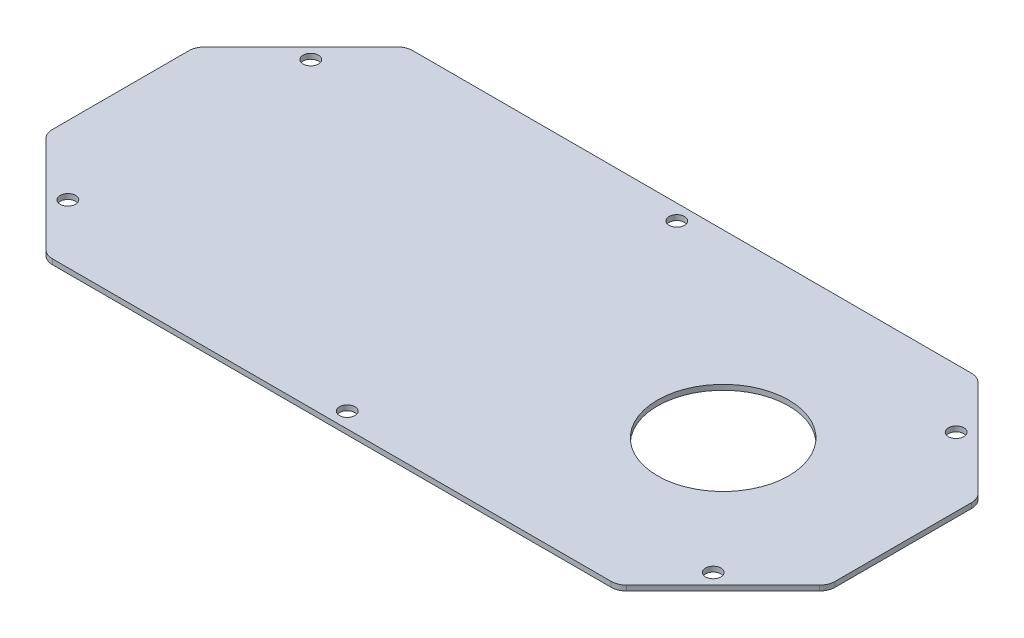
ISO-10303-21;
HEADER;
FILE_DESCRIPTION(('STEP AP214'),'2;1');
FILE_NAME('part.step','',(''),(''),'','','');
FILE_SCHEMA(('AUTOMOTIVE_DESIGN { 1 0 10303 214 1 1 1 1 }'));
ENDSEC;
DATA;
#1=APPLICATION_CONTEXT('core data for automotive mechanical design processes');
#2=APPLICATION_PROTOCOL_DEFINITION('international standard','automotive_design',2000,#1);
#3=PRODUCT_CONTEXT('',#1,'mechanical');
#4=PRODUCT('Part','Part','',(#3));
#5=PRODUCT_RELATED_PRODUCT_CATEGORY('part','',(#4));
#6=PRODUCT_DEFINITION_FORMATION('','',#4);
#7=PRODUCT_DEFINITION_CONTEXT('part definition',#1,'design');
#8=PRODUCT_DEFINITION('design','',#6,#7);
#9=PRODUCT_DEFINITION_SHAPE('','',#8);
#10=(LENGTH_UNIT() NAMED_UNIT(*) SI_UNIT(.MILLI.,.METRE.));
#11=(NAMED_UNIT(*) PLANE_ANGLE_UNIT() SI_UNIT($,.RADIAN.));
#12=(NAMED_UNIT(*) SI_UNIT($,.STERADIAN.) SOLID_ANGLE_UNIT());
#13=UNCERTAINTY_MEASURE_WITH_UNIT(LENGTH_MEASURE(1.E-05),#10,'distance_accuracy_value','');
#14=(GEOMETRIC_REPRESENTATION_CONTEXT(3) GLOBAL_UNCERTAINTY_ASSIGNED_CONTEXT((#13)) GLOBAL_UNIT_ASSIGNED_CONTEXT((#10,
#11,#12)) REPRESENTATION_CONTEXT('',''));
#15=CARTESIAN_POINT('',(0.,0.,0.));
#16=DIRECTION('',(0.,0.,1.));
#17=DIRECTION('',(1.,0.,0.));
#18=AXIS2_PLACEMENT_3D('',#15,#16,#17);
#19=CARTESIAN_POINT('',(-96.5025253169417,-1.,35.));
#20=DIRECTION('',(-0.707106781186547,0.,0.707106781186548));
#21=DIRECTION('',(0.707106781186548,0.,0.707106781186547));
#22=AXIS2_PLACEMENT_3D('',#19,#20,#21);
#23=PLANE('',#22);
#24=DIRECTION('',(0.707106781186548,0.,0.707106781186547));
#25=VECTOR('',#24,1.);
#26=CARTESIAN_POINT('',(-96.5025253169417,0.,35.));
#27=LINE('',#26,#25);
#28=CARTESIAN_POINT('',(-116.126845660501,0.,15.3756796564404));
#29=VERTEX_POINT('',#28);
#30=CARTESIAN_POINT('',(-97.3812049733821,0.,34.1213203435597));
#31=VERTEX_POINT('',#30);
#32=EDGE_CURVE('E258',#29,#31,#27,.T.);
#33=ORIENTED_EDGE('',*,*,#32,.F.);
#34=DIRECTION('',(0.,1.,0.));
#35=VECTOR('',#34,1.);
#36=CARTESIAN_POINT('',(-116.126845660501,-1.,15.3756796564404));
#37=LINE('',#36,#35);
#38=CARTESIAN_POINT('',(-116.126845660501,-1.,15.3756796564404));
#39=VERTEX_POINT('',#38);
#40=EDGE_CURVE('E236',#29,#39,#37,.F.);
#41=ORIENTED_EDGE('',*,*,#40,.T.);
#42=DIRECTION('',(0.707106781186548,0.,0.707106781186547));
#43=VECTOR('',#42,1.);
#44=CARTESIAN_POINT('',(-96.5025253169417,-1.,35.));
#45=LINE('',#44,#43);
#46=CARTESIAN_POINT('',(-97.3812049733821,-1.,34.1213203435597));
#47=VERTEX_POINT('',#46);
#48=EDGE_CURVE('E272',#39,#47,#45,.T.);
#49=ORIENTED_EDGE('',*,*,#48,.T.);
#50=DIRECTION('',(0.,1.,0.));
#51=VECTOR('',#50,1.);
#52=CARTESIAN_POINT('',(-97.3812049733821,-1.,34.1213203435597));
#53=LINE('',#52,#51);
#54=EDGE_CURVE('E233',#47,#31,#53,.T.);
#55=ORIENTED_EDGE('',*,*,#54,.T.);
#56=EDGE_LOOP('',(#33,#41,#49,#55));
#57=FACE_BOUND('',#56,.T.);
#58=ADVANCED_FACE('F36',(#57),#23,.T.);
#59=CARTESIAN_POINT('',(-117.005525316942,-1.,0.));
#60=DIRECTION('',(-1.,0.,0.));
#61=DIRECTION('',(0.,0.,1.));
#62=AXIS2_PLACEMENT_3D('',#59,#60,#61);
#63=PLANE('',#62);
#64=DIRECTION('',(0.,0.,1.));
#65=VECTOR('',#64,1.);
#66=CARTESIAN_POINT('',(-117.005525316942,0.,0.));
#67=LINE('',#66,#65);
#68=CARTESIAN_POINT('',(-117.005525316942,0.,-13.2543593128806));
#69=VERTEX_POINT('',#68);
#70=CARTESIAN_POINT('',(-117.005525316942,0.,13.2543593128807));
#71=VERTEX_POINT('',#70);
#72=EDGE_CURVE('E184',#69,#71,#67,.T.);
#73=ORIENTED_EDGE('',*,*,#72,.F.);
#74=DIRECTION('',(0.,1.,0.));
#75=VECTOR('',#74,1.);
#76=CARTESIAN_POINT('',(-117.005525316942,-1.,-13.2543593128806));
#77=LINE('',#76,#75);
#78=CARTESIAN_POINT('',(-117.005525316942,-1.,-13.2543593128806));
#79=VERTEX_POINT('',#78);
#80=EDGE_CURVE('E231',#69,#79,#77,.F.);
#81=ORIENTED_EDGE('',*,*,#80,.T.);
#82=DIRECTION('',(0.,0.,1.));
#83=VECTOR('',#82,1.);
#84=CARTESIAN_POINT('',(-117.005525316942,-1.,0.));
#85=LINE('',#84,#83);
#86=CARTESIAN_POINT('',(-117.005525316942,-1.,13.2543593128807));
#87=VERTEX_POINT('',#86);
#88=EDGE_CURVE('E177',#79,#87,#85,.T.);
#89=ORIENTED_EDGE('',*,*,#88,.T.);
#90=DIRECTION('',(0.,1.,0.));
#91=VECTOR('',#90,1.);
#92=CARTESIAN_POINT('',(-117.005525316942,-1.,13.2543593128807));
#93=LINE('',#92,#91);
#94=EDGE_CURVE('E228',#87,#71,#93,.T.);
#95=ORIENTED_EDGE('',*,*,#94,.T.);
#96=EDGE_LOOP('',(#73,#81,#89,#95));
#97=FACE_BOUND('',#96,.T.);
#98=ADVANCED_FACE('F302',(#97),#63,.T.);
#99=CARTESIAN_POINT('',(-96.5025253169417,-1.,-35.));
#100=DIRECTION('',(-0.707106781186548,0.,-0.707106781186547));
#101=DIRECTION('',(-0.707106781186547,0.,0.707106781186548));
#102=AXIS2_PLACEMENT_3D('',#99,#100,#101);
#103=PLANE('',#102);
#104=DIRECTION('',(-0.707106781186547,0.,0.707106781186548));
#105=VECTOR('',#104,1.);
#106=CARTESIAN_POINT('',(-96.5025253169417,0.,-35.));
#107=LINE('',#106,#105);
#108=CARTESIAN_POINT('',(-97.381204973382,0.,-34.1213203435597));
#109=VERTEX_POINT('',#108);
#110=CARTESIAN_POINT('',(-116.126845660501,0.,-15.3756796564402));
#111=VERTEX_POINT('',#110);
#112=EDGE_CURVE('E268',#109,#111,#107,.T.);
#113=ORIENTED_EDGE('',*,*,#112,.F.);
#114=DIRECTION('',(0.,1.,0.));
#115=VECTOR('',#114,1.);
#116=CARTESIAN_POINT('',(-97.381204973382,-1.,-34.1213203435597));
#117=LINE('',#116,#115);
#118=CARTESIAN_POINT('',(-97.381204973382,-1.,-34.1213203435597));
#119=VERTEX_POINT('',#118);
#120=EDGE_CURVE('E226',#109,#119,#117,.F.);
#121=ORIENTED_EDGE('',*,*,#120,.T.);
#122=DIRECTION('',(-0.707106781186547,0.,0.707106781186548));
#123=VECTOR('',#122,1.);
#124=CARTESIAN_POINT('',(-96.5025253169417,-1.,-35.));
#125=LINE('',#124,#123);
#126=CARTESIAN_POINT('',(-116.126845660501,-1.,-15.3756796564402));
#127=VERTEX_POINT('',#126);
#128=EDGE_CURVE('E181',#119,#127,#125,.T.);
#129=ORIENTED_EDGE('',*,*,#128,.T.);
#130=DIRECTION('',(0.,1.,0.));
#131=VECTOR('',#130,1.);
#132=CARTESIAN_POINT('',(-116.126845660501,-1.,-15.3756796564402));
#133=LINE('',#132,#131);
#134=EDGE_CURVE('E223',#127,#111,#133,.T.);
#135=ORIENTED_EDGE('',*,*,#134,.T.);
#136=EDGE_LOOP('',(#113,#121,#129,#135));
#137=FACE_BOUND('',#136,.T.);
#138=ADVANCED_FACE('F294',(#137),#103,.T.);
#139=CARTESIAN_POINT('',(14.4974746830583,-1.,-35.));
#140=DIRECTION('',(0.,0.,-1.));
#141=DIRECTION('',(-1.,0.,0.));
#142=AXIS2_PLACEMENT_3D('',#139,#140,#141);
#143=PLANE('',#142);
#144=DIRECTION('',(-1.,0.,0.));
#145=VECTOR('',#144,1.);
#146=CARTESIAN_POINT('',(14.4974746830583,0.,-35.));
#147=LINE('',#146,#145);
#148=CARTESIAN_POINT('',(13.254833995939,0.,-35.));
#149=VERTEX_POINT('',#148);
#150=CARTESIAN_POINT('',(-95.2598846298224,0.,-35.));
#151=VERTEX_POINT('',#150);
#152=EDGE_CURVE('E266',#149,#151,#147,.T.);
#153=ORIENTED_EDGE('',*,*,#152,.F.);
#154=DIRECTION('',(0.,1.,0.));
#155=VECTOR('',#154,1.);
#156=CARTESIAN_POINT('',(13.254833995939,-1.,-35.));
#157=LINE('',#156,#155);
#158=CARTESIAN_POINT('',(13.254833995939,-1.,-35.));
#159=VERTEX_POINT('',#158);
#160=EDGE_CURVE('E221',#149,#159,#157,.F.);
#161=ORIENTED_EDGE('',*,*,#160,.T.);
#162=DIRECTION('',(-1.,0.,0.));
#163=VECTOR('',#162,1.);
#164=CARTESIAN_POINT('',(14.4974746830583,-1.,-35.));
#165=LINE('',#164,#163);
#166=CARTESIAN_POINT('',(-95.2598846298224,-1.,-35.));
#167=VERTEX_POINT('',#166);
#168=EDGE_CURVE('E287',#159,#167,#165,.T.);
#169=ORIENTED_EDGE('',*,*,#168,.T.);
#170=DIRECTION('',(0.,1.,0.));
#171=VECTOR('',#170,1.);
#172=CARTESIAN_POINT('',(-95.2598846298224,-1.,-35.));
#173=LINE('',#172,#171);
#174=EDGE_CURVE('E218',#167,#151,#173,.T.);
#175=ORIENTED_EDGE('',*,*,#174,.T.);
#176=EDGE_LOOP('',(#153,#161,#169,#175));
#177=FACE_BOUND('',#176,.T.);
#178=ADVANCED_FACE('F433',(#177),#143,.T.);
#179=CARTESIAN_POINT('',(35.,-1.,-14.4974746830583));
#180=DIRECTION('',(0.707106781186547,0.,-0.707106781186548));
#181=DIRECTION('',(-0.707106781186548,0.,-0.707106781186547));
#182=AXIS2_PLACEMENT_3D('',#179,#180,#181);
#183=PLANE('',#182);
#184=DIRECTION('',(-0.707106781186548,0.,-0.707106781186547));
#185=VECTOR('',#184,1.);
#186=CARTESIAN_POINT('',(35.,0.,-14.4974746830583));
#187=LINE('',#186,#185);
#188=CARTESIAN_POINT('',(34.1213203435596,0.,-15.3761543394987));
#189=VERTEX_POINT('',#188);
#190=CARTESIAN_POINT('',(15.3761543394986,0.,-34.1213203435597));
#191=VERTEX_POINT('',#190);
#192=EDGE_CURVE('E172',#189,#191,#187,.T.);
#193=ORIENTED_EDGE('',*,*,#192,.F.);
#194=DIRECTION('',(0.,1.,0.));
#195=VECTOR('',#194,1.);
#196=CARTESIAN_POINT('',(34.1213203435596,-1.,-15.3761543394987));
#197=LINE('',#196,#195);
#198=CARTESIAN_POINT('',(34.1213203435596,-1.,-15.3761543394987));
#199=VERTEX_POINT('',#198);
#200=EDGE_CURVE('E202',#189,#199,#197,.F.);
#201=ORIENTED_EDGE('',*,*,#200,.T.);
#202=DIRECTION('',(-0.707106781186548,0.,-0.707106781186547));
#203=VECTOR('',#202,1.);
#204=CARTESIAN_POINT('',(35.,-1.,-14.4974746830583));
#205=LINE('',#204,#203);
#206=CARTESIAN_POINT('',(15.3761543394986,-1.,-34.1213203435597));
#207=VERTEX_POINT('',#206);
#208=EDGE_CURVE('E284',#199,#207,#205,.T.);
#209=ORIENTED_EDGE('',*,*,#208,.T.);
#210=DIRECTION('',(0.,1.,0.));
#211=VECTOR('',#210,1.);
#212=CARTESIAN_POINT('',(15.3761543394986,-1.,-34.1213203435597));
#213=LINE('',#212,#211);
#214=EDGE_CURVE('E199',#207,#191,#213,.T.);
#215=ORIENTED_EDGE('',*,*,#214,.T.);
#216=EDGE_LOOP('',(#193,#201,#209,#215));
#217=FACE_BOUND('',#216,.T.);
#218=ADVANCED_FACE('F436',(#217),#183,.T.);
#219=CARTESIAN_POINT('',(35.,-1.,14.4974746830583));
#220=DIRECTION('',(1.,0.,0.));
#221=DIRECTION('',(0.,0.,-1.));
#222=AXIS2_PLACEMENT_3D('',#219,#220,#221);
#223=PLANE('',#222);
#224=DIRECTION('',(0.,0.,-1.));
#225=VECTOR('',#224,1.);
#226=CARTESIAN_POINT('',(35.,-1.,14.4974746830583));
#227=LINE('',#226,#225);
#228=CARTESIAN_POINT('',(35.,-1.,13.254833995939));
#229=VERTEX_POINT('',#228);
#230=CARTESIAN_POINT('',(35.,-1.,-13.254833995939));
#231=VERTEX_POINT('',#230);
#232=EDGE_CURVE('E250',#229,#231,#227,.T.);
#233=ORIENTED_EDGE('',*,*,#232,.T.);
#234=DIRECTION('',(0.,1.,0.));
#235=VECTOR('',#234,1.);
#236=CARTESIAN_POINT('',(35.,-1.,-13.2548339959391));
#237=LINE('',#236,#235);
#238=CARTESIAN_POINT('',(35.,0.,-13.254833995939));
#239=VERTEX_POINT('',#238);
#240=EDGE_CURVE('E171',#231,#239,#237,.T.);
#241=ORIENTED_EDGE('',*,*,#240,.T.);
#242=DIRECTION('',(0.,0.,-1.));
#243=VECTOR('',#242,1.);
#244=CARTESIAN_POINT('',(35.,0.,14.4974746830583));
#245=LINE('',#244,#243);
#246=CARTESIAN_POINT('',(35.,0.,13.254833995939));
#247=VERTEX_POINT('',#246);
#248=EDGE_CURVE('E155',#247,#239,#245,.T.);
#249=ORIENTED_EDGE('',*,*,#248,.F.);
#250=DIRECTION('',(0.,1.,0.));
#251=VECTOR('',#250,1.);
#252=CARTESIAN_POINT('',(35.,-1.,13.254833995939));
#253=LINE('',#252,#251);
#254=EDGE_CURVE('E168',#247,#229,#253,.F.);
#255=ORIENTED_EDGE('',*,*,#254,.T.);
#256=EDGE_LOOP('',(#233,#241,#249,#255));
#257=FACE_BOUND('',#256,.T.);
#258=ADVANCED_FACE('F167',(#257),#223,.T.);
#259=CARTESIAN_POINT('',(14.4974746830583,-1.,35.));
#260=DIRECTION('',(0.707106781186548,0.,0.707106781186547));
#261=DIRECTION('',(0.707106781186547,0.,-0.707106781186548));
#262=AXIS2_PLACEMENT_3D('',#259,#260,#261);
#263=PLANE('',#262);
#264=DIRECTION('',(0.707106781186547,0.,-0.707106781186548));
#265=VECTOR('',#264,1.);
#266=CARTESIAN_POINT('',(14.4974746830583,-1.,35.));
#267=LINE('',#266,#265);
#268=CARTESIAN_POINT('',(15.3761543394987,-1.,34.1213203435596));
#269=VERTEX_POINT('',#268);
#270=CARTESIAN_POINT('',(34.1213203435597,-1.,15.3761543394986));
#271=VERTEX_POINT('',#270);
#272=EDGE_CURVE('E246',#269,#271,#267,.T.);
#273=ORIENTED_EDGE('',*,*,#272,.T.);
#274=DIRECTION('',(0.,1.,0.));
#275=VECTOR('',#274,1.);
#276=CARTESIAN_POINT('',(34.1213203435597,-1.,15.3761543394987));
#277=LINE('',#276,#275);
#278=CARTESIAN_POINT('',(34.1213203435597,0.,15.3761543394986));
#279=VERTEX_POINT('',#278);
#280=EDGE_CURVE('E11',#271,#279,#277,.T.);
#281=ORIENTED_EDGE('',*,*,#280,.T.);
#282=DIRECTION('',(0.707106781186547,0.,-0.707106781186548));
#283=VECTOR('',#282,1.);
#284=CARTESIAN_POINT('',(14.4974746830583,0.,35.));
#285=LINE('',#284,#283);
#286=CARTESIAN_POINT('',(15.3761543394987,0.,34.1213203435596));
#287=VERTEX_POINT('',#286);
#288=EDGE_CURVE('E157',#287,#279,#285,.T.);
#289=ORIENTED_EDGE('',*,*,#288,.F.);
#290=DIRECTION('',(0.,1.,0.));
#291=VECTOR('',#290,1.);
#292=CARTESIAN_POINT('',(15.3761543394987,-1.,34.1213203435596));
#293=LINE('',#292,#291);
#294=EDGE_CURVE('E45',#287,#269,#293,.F.);
#295=ORIENTED_EDGE('',*,*,#294,.T.);
#296=EDGE_LOOP('',(#273,#281,#289,#295));
#297=FACE_BOUND('',#296,.T.);
#298=ADVANCED_FACE('F245',(#297),#263,.T.);
#299=CARTESIAN_POINT('',(-96.5025253169417,-1.,35.));
#300=DIRECTION('',(0.,0.,1.));
#301=DIRECTION('',(1.,0.,0.));
#302=AXIS2_PLACEMENT_3D('',#299,#300,#301);
#303=PLANE('',#302);
#304=DIRECTION('',(1.,0.,0.));
#305=VECTOR('',#304,1.);
#306=CARTESIAN_POINT('',(-96.5025253169417,0.,35.));
#307=LINE('',#306,#305);
#308=CARTESIAN_POINT('',(-95.2598846298224,0.,35.));
#309=VERTEX_POINT('',#308);
#310=CARTESIAN_POINT('',(13.2548339959391,0.,35.));
#311=VERTEX_POINT('',#310);
#312=EDGE_CURVE('E256',#309,#311,#307,.T.);
#313=ORIENTED_EDGE('',*,*,#312,.F.);
#314=DIRECTION('',(0.,1.,0.));
#315=VECTOR('',#314,1.);
#316=CARTESIAN_POINT('',(-95.2598846298224,-1.,35.));
#317=LINE('',#316,#315);
#318=CARTESIAN_POINT('',(-95.2598846298224,-1.,35.));
#319=VERTEX_POINT('',#318);
#320=EDGE_CURVE('E59',#309,#319,#317,.F.);
#321=ORIENTED_EDGE('',*,*,#320,.T.);
#322=DIRECTION('',(1.,0.,0.));
#323=VECTOR('',#322,1.);
#324=CARTESIAN_POINT('',(-96.5025253169417,-1.,35.));
#325=LINE('',#324,#323);
#326=CARTESIAN_POINT('',(13.2548339959391,-1.,35.));
#327=VERTEX_POINT('',#326);
#328=EDGE_CURVE('E251',#319,#327,#325,.T.);
#329=ORIENTED_EDGE('',*,*,#328,.T.);
#330=DIRECTION('',(0.,1.,0.));
#331=VECTOR('',#330,1.);
#332=CARTESIAN_POINT('',(13.2548339959391,-1.,35.));
#333=LINE('',#332,#331);
#334=EDGE_CURVE('E238',#327,#311,#333,.T.);
#335=ORIENTED_EDGE('',*,*,#334,.T.);
#336=EDGE_LOOP('',(#313,#321,#329,#335));
#337=FACE_BOUND('',#336,.T.);
#338=ADVANCED_FACE('F255',(#337),#303,.T.);
#339=CARTESIAN_POINT('',(0.,-1.,0.));
#340=DIRECTION('',(0.,1.,0.));
#341=DIRECTION('',(0.,0.,1.));
#342=AXIS2_PLACEMENT_3D('',#339,#340,#341);
#343=PLANE('',#342);
#344=CARTESIAN_POINT('',(0.,-1.,0.));
#345=DIRECTION('',(0.,-1.,0.));
#346=DIRECTION('',(0.,0.,-1.));
#347=AXIS2_PLACEMENT_3D('',#344,#345,#346);
#348=CIRCLE('',#347,12.75);
#349=CARTESIAN_POINT('',(0.,-1.,-12.75));
#350=VERTEX_POINT('',#349);
#351=EDGE_CURVE('E609',#350,#350,#348,.T.);
#352=ORIENTED_EDGE('',*,*,#351,.F.);
#353=EDGE_LOOP('',(#352));
#354=FACE_BOUND('',#353,.T.);
#355=CARTESIAN_POINT('',(-41.0025253169417,-0.999999999999999,32.));
#356=DIRECTION('',(0.,1.,0.));
#357=DIRECTION('',(0.,0.,1.));
#358=AXIS2_PLACEMENT_3D('',#355,#356,#357);
#359=CIRCLE('',#358,1.5);
#360=CARTESIAN_POINT('',(-41.0025253169417,-0.999999999999999,33.5));
#361=VERTEX_POINT('',#360);
#362=EDGE_CURVE('E603',#361,#361,#359,.T.);
#363=ORIENTED_EDGE('',*,*,#362,.T.);
#364=EDGE_LOOP('',(#363));
#365=FACE_BOUND('',#364,.T.);
#366=CARTESIAN_POINT('',(-103.671600061011,-0.999999999999999,23.5882845688112));
#367=DIRECTION('',(0.,1.,0.));
#368=DIRECTION('',(0.,0.,1.));
#369=AXIS2_PLACEMENT_3D('',#366,#367,#368);
#370=CIRCLE('',#369,1.5);
#371=CARTESIAN_POINT('',(-103.671600061011,-0.999999999999999,25.0882845688112));
#372=VERTEX_POINT('',#371);
#373=EDGE_CURVE('E597',#372,#372,#370,.T.);
#374=ORIENTED_EDGE('',*,*,#373,.T.);
#375=EDGE_LOOP('',(#374));
#376=FACE_BOUND('',#375,.T.);
#377=CARTESIAN_POINT('',(21.6663120855987,-0.999999999999999,23.5885219103403));
#378=DIRECTION('',(0.,1.,0.));
#379=DIRECTION('',(0.,0.,1.));
#380=AXIS2_PLACEMENT_3D('',#377,#378,#379);
#381=CIRCLE('',#380,1.5);
#382=CARTESIAN_POINT('',(21.6663120855987,-0.999999999999999,25.0885219103403));
#383=VERTEX_POINT('',#382);
#384=EDGE_CURVE('E591',#383,#383,#381,.T.);
#385=ORIENTED_EDGE('',*,*,#384,.T.);
#386=EDGE_LOOP('',(#385));
#387=FACE_BOUND('',#386,.T.);
#388=CARTESIAN_POINT('',(21.6663120855987,-0.999999999999999,-23.5885219103404));
#389=DIRECTION('',(0.,1.,0.));
#390=DIRECTION('',(0.,0.,1.));
#391=AXIS2_PLACEMENT_3D('',#388,#389,#390);
#392=CIRCLE('',#391,1.5);
#393=CARTESIAN_POINT('',(21.6663120855987,-0.999999999999999,-22.0885219103404));
#394=VERTEX_POINT('',#393);
#395=EDGE_CURVE('E585',#394,#394,#392,.T.);
#396=ORIENTED_EDGE('',*,*,#395,.T.);
#397=EDGE_LOOP('',(#396));
#398=FACE_BOUND('',#397,.T.);
#399=CARTESIAN_POINT('',(-41.0025253169417,-0.999999999999999,-32.));
#400=DIRECTION('',(0.,1.,0.));
#401=DIRECTION('',(0.,0.,1.));
#402=AXIS2_PLACEMENT_3D('',#399,#400,#401);
#403=CIRCLE('',#402,1.5);
#404=CARTESIAN_POINT('',(-41.0025253169417,-0.999999999999999,-30.5));
#405=VERTEX_POINT('',#404);
#406=EDGE_CURVE('E578',#405,#405,#403,.T.);
#407=ORIENTED_EDGE('',*,*,#406,.T.);
#408=EDGE_LOOP('',(#407));
#409=FACE_BOUND('',#408,.T.);
#410=CARTESIAN_POINT('',(-103.671600061011,-0.999999999999999,-23.5882845688112));
#411=DIRECTION('',(0.,1.,0.));
#412=DIRECTION('',(0.,0.,1.));
#413=AXIS2_PLACEMENT_3D('',#410,#411,#412);
#414=CIRCLE('',#413,1.5);
#415=CARTESIAN_POINT('',(-103.671600061011,-0.999999999999999,-22.0882845688112));
#416=VERTEX_POINT('',#415);
#417=EDGE_CURVE('E261',#416,#416,#414,.T.);
#418=ORIENTED_EDGE('',*,*,#417,.T.);
#419=EDGE_LOOP('',(#418));
#420=FACE_BOUND('',#419,.T.);
#421=ORIENTED_EDGE('',*,*,#208,.F.);
#422=CARTESIAN_POINT('',(32.,-1.,-13.2548339959391));
#423=DIRECTION('',(0.,1.,0.));
#424=DIRECTION('',(0.,0.,1.));
#425=AXIS2_PLACEMENT_3D('',#422,#423,#424);
#426=CIRCLE('',#425,3.);
#427=EDGE_CURVE('E216',#199,#231,#426,.F.);
#428=ORIENTED_EDGE('',*,*,#427,.T.);
#429=ORIENTED_EDGE('',*,*,#232,.F.);
#430=CARTESIAN_POINT('',(32.,-1.,13.254833995939));
#431=DIRECTION('',(0.,1.,0.));
#432=DIRECTION('',(0.,0.,1.));
#433=AXIS2_PLACEMENT_3D('',#430,#431,#432);
#434=CIRCLE('',#433,3.);
#435=EDGE_CURVE('E176',#229,#271,#434,.F.);
#436=ORIENTED_EDGE('',*,*,#435,.T.);
#437=ORIENTED_EDGE('',*,*,#272,.F.);
#438=CARTESIAN_POINT('',(13.2548339959391,-1.,32.));
#439=DIRECTION('',(0.,1.,0.));
#440=DIRECTION('',(0.,0.,1.));
#441=AXIS2_PLACEMENT_3D('',#438,#439,#440);
#442=CIRCLE('',#441,3.);
#443=EDGE_CURVE('E52',#269,#327,#442,.F.);
#444=ORIENTED_EDGE('',*,*,#443,.T.);
#445=ORIENTED_EDGE('',*,*,#328,.F.);
#446=CARTESIAN_POINT('',(-95.2598846298224,-1.,32.));
#447=DIRECTION('',(0.,1.,0.));
#448=DIRECTION('',(0.,0.,1.));
#449=AXIS2_PLACEMENT_3D('',#446,#447,#448);
#450=CIRCLE('',#449,3.);
#451=EDGE_CURVE('E206',#319,#47,#450,.F.);
#452=ORIENTED_EDGE('',*,*,#451,.T.);
#453=ORIENTED_EDGE('',*,*,#48,.F.);
#454=CARTESIAN_POINT('',(-114.005525316942,-1.,13.2543593128807));
#455=DIRECTION('',(0.,1.,0.));
#456=DIRECTION('',(0.,0.,1.));
#457=AXIS2_PLACEMENT_3D('',#454,#455,#456);
#458=CIRCLE('',#457,3.);
#459=EDGE_CURVE('E208',#39,#87,#458,.F.);
#460=ORIENTED_EDGE('',*,*,#459,.T.);
#461=ORIENTED_EDGE('',*,*,#88,.F.);
#462=CARTESIAN_POINT('',(-114.005525316942,-1.,-13.2543593128806));
#463=DIRECTION('',(0.,1.,0.));
#464=DIRECTION('',(0.,0.,1.));
#465=AXIS2_PLACEMENT_3D('',#462,#463,#464);
#466=CIRCLE('',#465,3.);
#467=EDGE_CURVE('E210',#79,#127,#466,.F.);
#468=ORIENTED_EDGE('',*,*,#467,.T.);
#469=ORIENTED_EDGE('',*,*,#128,.F.);
#470=CARTESIAN_POINT('',(-95.2598846298224,-1.,-32.));
#471=DIRECTION('',(0.,1.,0.));
#472=DIRECTION('',(0.,0.,1.));
#473=AXIS2_PLACEMENT_3D('',#470,#471,#472);
#474=CIRCLE('',#473,3.);
#475=EDGE_CURVE('E212',#119,#167,#474,.F.);
#476=ORIENTED_EDGE('',*,*,#475,.T.);
#477=ORIENTED_EDGE('',*,*,#168,.F.);
#478=CARTESIAN_POINT('',(13.254833995939,-1.,-32.));
#479=DIRECTION('',(0.,1.,0.));
#480=DIRECTION('',(0.,0.,1.));
#481=AXIS2_PLACEMENT_3D('',#478,#479,#480);
#482=CIRCLE('',#481,3.);
#483=EDGE_CURVE('E214',#159,#207,#482,.F.);
#484=ORIENTED_EDGE('',*,*,#483,.T.);
#485=EDGE_LOOP('',(#421,#428,#429,#436,#437,#444,#445,#452,#453,#460,#461,#468,#469,#476,#477,#484));
#486=FACE_BOUND('',#485,.T.);
#487=ADVANCED_FACE('F249',(#354,#365,#376,#387,#398,#409,#420,#486),#343,.F.);
#488=CARTESIAN_POINT('',(0.,0.,0.));
#489=DIRECTION('',(0.,1.,0.));
#490=DIRECTION('',(0.,0.,1.));
#491=AXIS2_PLACEMENT_3D('',#488,#489,#490);
#492=PLANE('',#491);
#493=CARTESIAN_POINT('',(0.,0.,0.));
#494=DIRECTION('',(0.,1.,0.));
#495=DIRECTION('',(0.,0.,1.));
#496=AXIS2_PLACEMENT_3D('',#493,#494,#495);
#497=CIRCLE('',#496,12.75);
#498=CARTESIAN_POINT('',(0.,0.,12.75));
#499=VERTEX_POINT('',#498);
#500=EDGE_CURVE('E40',#499,#499,#497,.T.);
#501=ORIENTED_EDGE('',*,*,#500,.F.);
#502=EDGE_LOOP('',(#501));
#503=FACE_BOUND('',#502,.T.);
#504=CARTESIAN_POINT('',(-41.0025253169417,0.,32.));
#505=DIRECTION('',(0.,1.,0.));
#506=DIRECTION('',(0.,0.,1.));
#507=AXIS2_PLACEMENT_3D('',#504,#505,#506);
#508=CIRCLE('',#507,1.5);
#509=CARTESIAN_POINT('',(-41.0025253169417,0.,33.5));
#510=VERTEX_POINT('',#509);
#511=EDGE_CURVE('E606',#510,#510,#508,.T.);
#512=ORIENTED_EDGE('',*,*,#511,.F.);
#513=EDGE_LOOP('',(#512));
#514=FACE_BOUND('',#513,.T.);
#515=CARTESIAN_POINT('',(-103.671600061011,0.,23.5882845688112));
#516=DIRECTION('',(0.,1.,0.));
#517=DIRECTION('',(0.,0.,1.));
#518=AXIS2_PLACEMENT_3D('',#515,#516,#517);
#519=CIRCLE('',#518,1.5);
#520=CARTESIAN_POINT('',(-103.671600061011,0.,25.0882845688112));
#521=VERTEX_POINT('',#520);
#522=EDGE_CURVE('E600',#521,#521,#519,.T.);
#523=ORIENTED_EDGE('',*,*,#522,.F.);
#524=EDGE_LOOP('',(#523));
#525=FACE_BOUND('',#524,.T.);
#526=CARTESIAN_POINT('',(21.6663120855987,0.,23.5885219103403));
#527=DIRECTION('',(0.,1.,0.));
#528=DIRECTION('',(0.,0.,1.));
#529=AXIS2_PLACEMENT_3D('',#526,#527,#528);
#530=CIRCLE('',#529,1.5);
#531=CARTESIAN_POINT('',(21.6663120855987,0.,25.0885219103403));
#532=VERTEX_POINT('',#531);
#533=EDGE_CURVE('E594',#532,#532,#530,.T.);
#534=ORIENTED_EDGE('',*,*,#533,.F.);
#535=EDGE_LOOP('',(#534));
#536=FACE_BOUND('',#535,.T.);
#537=CARTESIAN_POINT('',(21.6663120855987,0.,-23.5885219103404));
#538=DIRECTION('',(0.,1.,0.));
#539=DIRECTION('',(0.,0.,1.));
#540=AXIS2_PLACEMENT_3D('',#537,#538,#539);
#541=CIRCLE('',#540,1.5);
#542=CARTESIAN_POINT('',(21.6663120855987,0.,-22.0885219103404));
#543=VERTEX_POINT('',#542);
#544=EDGE_CURVE('E588',#543,#543,#541,.T.);
#545=ORIENTED_EDGE('',*,*,#544,.F.);
#546=EDGE_LOOP('',(#545));
#547=FACE_BOUND('',#546,.T.);
#548=CARTESIAN_POINT('',(-41.0025253169417,0.,-32.));
#549=DIRECTION('',(0.,1.,0.));
#550=DIRECTION('',(0.,0.,1.));
#551=AXIS2_PLACEMENT_3D('',#548,#549,#550);
#552=CIRCLE('',#551,1.5);
#553=CARTESIAN_POINT('',(-41.0025253169417,0.,-30.5));
#554=VERTEX_POINT('',#553);
#555=EDGE_CURVE('E580',#554,#554,#552,.T.);
#556=ORIENTED_EDGE('',*,*,#555,.F.);
#557=EDGE_LOOP('',(#556));
#558=FACE_BOUND('',#557,.T.);
#559=CARTESIAN_POINT('',(-103.671600061011,0.,-23.5882845688112));
#560=DIRECTION('',(0.,1.,0.));
#561=DIRECTION('',(0.,0.,1.));
#562=AXIS2_PLACEMENT_3D('',#559,#560,#561);
#563=CIRCLE('',#562,1.5);
#564=CARTESIAN_POINT('',(-103.671600061011,0.,-22.0882845688112));
#565=VERTEX_POINT('',#564);
#566=EDGE_CURVE('E574',#565,#565,#563,.T.);
#567=ORIENTED_EDGE('',*,*,#566,.F.);
#568=EDGE_LOOP('',(#567));
#569=FACE_BOUND('',#568,.T.);
#570=ORIENTED_EDGE('',*,*,#248,.T.);
#571=CARTESIAN_POINT('',(32.,0.,-13.2548339959391));
#572=DIRECTION('',(0.,1.,0.));
#573=DIRECTION('',(0.,0.,1.));
#574=AXIS2_PLACEMENT_3D('',#571,#572,#573);
#575=CIRCLE('',#574,3.);
#576=EDGE_CURVE('E197',#239,#189,#575,.T.);
#577=ORIENTED_EDGE('',*,*,#576,.T.);
#578=ORIENTED_EDGE('',*,*,#192,.T.);
#579=CARTESIAN_POINT('',(13.254833995939,0.,-32.));
#580=DIRECTION('',(0.,1.,0.));
#581=DIRECTION('',(0.,0.,1.));
#582=AXIS2_PLACEMENT_3D('',#579,#580,#581);
#583=CIRCLE('',#582,3.);
#584=EDGE_CURVE('E195',#191,#149,#583,.T.);
#585=ORIENTED_EDGE('',*,*,#584,.T.);
#586=ORIENTED_EDGE('',*,*,#152,.T.);
#587=CARTESIAN_POINT('',(-95.2598846298224,0.,-32.));
#588=DIRECTION('',(0.,1.,0.));
#589=DIRECTION('',(0.,0.,1.));
#590=AXIS2_PLACEMENT_3D('',#587,#588,#589);
#591=CIRCLE('',#590,3.);
#592=EDGE_CURVE('E193',#151,#109,#591,.T.);
#593=ORIENTED_EDGE('',*,*,#592,.T.);
#594=ORIENTED_EDGE('',*,*,#112,.T.);
#595=CARTESIAN_POINT('',(-114.005525316942,0.,-13.2543593128806));
#596=DIRECTION('',(0.,1.,0.));
#597=DIRECTION('',(0.,0.,1.));
#598=AXIS2_PLACEMENT_3D('',#595,#596,#597);
#599=CIRCLE('',#598,3.);
#600=EDGE_CURVE('E191',#111,#69,#599,.T.);
#601=ORIENTED_EDGE('',*,*,#600,.T.);
#602=ORIENTED_EDGE('',*,*,#72,.T.);
#603=CARTESIAN_POINT('',(-114.005525316942,0.,13.2543593128807));
#604=DIRECTION('',(0.,1.,0.));
#605=DIRECTION('',(0.,0.,1.));
#606=AXIS2_PLACEMENT_3D('',#603,#604,#605);
#607=CIRCLE('',#606,3.);
#608=EDGE_CURVE('E189',#71,#29,#607,.T.);
#609=ORIENTED_EDGE('',*,*,#608,.T.);
#610=ORIENTED_EDGE('',*,*,#32,.T.);
#611=CARTESIAN_POINT('',(-95.2598846298224,0.,32.));
#612=DIRECTION('',(0.,1.,0.));
#613=DIRECTION('',(0.,0.,1.));
#614=AXIS2_PLACEMENT_3D('',#611,#612,#613);
#615=CIRCLE('',#614,3.);
#616=EDGE_CURVE('E161',#31,#309,#615,.T.);
#617=ORIENTED_EDGE('',*,*,#616,.T.);
#618=ORIENTED_EDGE('',*,*,#312,.T.);
#619=CARTESIAN_POINT('',(13.2548339959391,0.,32.));
#620=DIRECTION('',(0.,1.,0.));
#621=DIRECTION('',(0.,0.,1.));
#622=AXIS2_PLACEMENT_3D('',#619,#620,#621);
#623=CIRCLE('',#622,3.);
#624=EDGE_CURVE('E162',#311,#287,#623,.T.);
#625=ORIENTED_EDGE('',*,*,#624,.T.);
#626=ORIENTED_EDGE('',*,*,#288,.T.);
#627=CARTESIAN_POINT('',(32.,0.,13.254833995939));
#628=DIRECTION('',(0.,1.,0.));
#629=DIRECTION('',(0.,0.,1.));
#630=AXIS2_PLACEMENT_3D('',#627,#628,#629);
#631=CIRCLE('',#630,3.);
#632=EDGE_CURVE('E152',#279,#247,#631,.T.);
#633=ORIENTED_EDGE('',*,*,#632,.T.);
#634=EDGE_LOOP('',(#570,#577,#578,#585,#586,#593,#594,#601,#602,#609,#610,#617,#618,#625,#626,#633));
#635=FACE_BOUND('',#634,.T.);
#636=ADVANCED_FACE('F154',(#503,#514,#525,#536,#547,#558,#569,#635),#492,.T.);
#637=CARTESIAN_POINT('',(-103.671600061011,-10.,-23.5882845688112));
#638=DIRECTION('',(0.,1.,0.));
#639=DIRECTION('',(0.,0.,1.));
#640=AXIS2_PLACEMENT_3D('',#637,#638,#639);
#641=CYLINDRICAL_SURFACE('',#640,1.5);
#642=ORIENTED_EDGE('',*,*,#566,.T.);
#643=EDGE_LOOP('',(#642));
#644=FACE_BOUND('',#643,.T.);
#645=ORIENTED_EDGE('',*,*,#417,.F.);
#646=EDGE_LOOP('',(#645));
#647=FACE_BOUND('',#646,.T.);
#648=ADVANCED_FACE('F392',(#644,#647),#641,.F.);
#649=CARTESIAN_POINT('',(-41.0025253169417,-10.,-32.));
#650=DIRECTION('',(0.,1.,0.));
#651=DIRECTION('',(0.,0.,1.));
#652=AXIS2_PLACEMENT_3D('',#649,#650,#651);
#653=CYLINDRICAL_SURFACE('',#652,1.5);
#654=ORIENTED_EDGE('',*,*,#555,.T.);
#655=EDGE_LOOP('',(#654));
#656=FACE_BOUND('',#655,.T.);
#657=ORIENTED_EDGE('',*,*,#406,.F.);
#658=EDGE_LOOP('',(#657));
#659=FACE_BOUND('',#658,.T.);
#660=ADVANCED_FACE('F424',(#656,#659),#653,.F.);
#661=CARTESIAN_POINT('',(21.6663120855987,-10.,-23.5885219103404));
#662=DIRECTION('',(0.,1.,0.));
#663=DIRECTION('',(0.,0.,1.));
#664=AXIS2_PLACEMENT_3D('',#661,#662,#663);
#665=CYLINDRICAL_SURFACE('',#664,1.5);
#666=ORIENTED_EDGE('',*,*,#544,.T.);
#667=EDGE_LOOP('',(#666));
#668=FACE_BOUND('',#667,.T.);
#669=ORIENTED_EDGE('',*,*,#395,.F.);
#670=EDGE_LOOP('',(#669));
#671=FACE_BOUND('',#670,.T.);
#672=ADVANCED_FACE('F420',(#668,#671),#665,.F.);
#673=CARTESIAN_POINT('',(21.6663120855987,-10.,23.5885219103403));
#674=DIRECTION('',(0.,1.,0.));
#675=DIRECTION('',(0.,0.,1.));
#676=AXIS2_PLACEMENT_3D('',#673,#674,#675);
#677=CYLINDRICAL_SURFACE('',#676,1.5);
#678=ORIENTED_EDGE('',*,*,#533,.T.);
#679=EDGE_LOOP('',(#678));
#680=FACE_BOUND('',#679,.T.);
#681=ORIENTED_EDGE('',*,*,#384,.F.);
#682=EDGE_LOOP('',(#681));
#683=FACE_BOUND('',#682,.T.);
#684=ADVANCED_FACE('F416',(#680,#683),#677,.F.);
#685=CARTESIAN_POINT('',(-103.671600061011,-10.,23.5882845688112));
#686=DIRECTION('',(0.,1.,0.));
#687=DIRECTION('',(0.,0.,1.));
#688=AXIS2_PLACEMENT_3D('',#685,#686,#687);
#689=CYLINDRICAL_SURFACE('',#688,1.5);
#690=ORIENTED_EDGE('',*,*,#522,.T.);
#691=EDGE_LOOP('',(#690));
#692=FACE_BOUND('',#691,.T.);
#693=ORIENTED_EDGE('',*,*,#373,.F.);
#694=EDGE_LOOP('',(#693));
#695=FACE_BOUND('',#694,.T.);
#696=ADVANCED_FACE('F412',(#692,#695),#689,.F.);
#697=CARTESIAN_POINT('',(-41.0025253169417,-10.,32.));
#698=DIRECTION('',(0.,1.,0.));
#699=DIRECTION('',(0.,0.,1.));
#700=AXIS2_PLACEMENT_3D('',#697,#698,#699);
#701=CYLINDRICAL_SURFACE('',#700,1.5);
#702=ORIENTED_EDGE('',*,*,#511,.T.);
#703=EDGE_LOOP('',(#702));
#704=FACE_BOUND('',#703,.T.);
#705=ORIENTED_EDGE('',*,*,#362,.F.);
#706=EDGE_LOOP('',(#705));
#707=FACE_BOUND('',#706,.T.);
#708=ADVANCED_FACE('F333',(#704,#707),#701,.F.);
#709=CARTESIAN_POINT('',(32.,-1.,-13.2548339959391));
#710=DIRECTION('',(0.,1.,0.));
#711=DIRECTION('',(0.,0.,1.));
#712=AXIS2_PLACEMENT_3D('',#709,#710,#711);
#713=CYLINDRICAL_SURFACE('',#712,3.);
#714=ORIENTED_EDGE('',*,*,#427,.F.);
#715=ORIENTED_EDGE('',*,*,#200,.F.);
#716=ORIENTED_EDGE('',*,*,#576,.F.);
#717=ORIENTED_EDGE('',*,*,#240,.F.);
#718=EDGE_LOOP('',(#714,#715,#716,#717));
#719=FACE_BOUND('',#718,.T.);
#720=ADVANCED_FACE('F329',(#719),#713,.T.);
#721=CARTESIAN_POINT('',(13.254833995939,-1.,-32.));
#722=DIRECTION('',(0.,1.,0.));
#723=DIRECTION('',(0.,0.,1.));
#724=AXIS2_PLACEMENT_3D('',#721,#722,#723);
#725=CYLINDRICAL_SURFACE('',#724,3.);
#726=ORIENTED_EDGE('',*,*,#483,.F.);
#727=ORIENTED_EDGE('',*,*,#160,.F.);
#728=ORIENTED_EDGE('',*,*,#584,.F.);
#729=ORIENTED_EDGE('',*,*,#214,.F.);
#730=EDGE_LOOP('',(#726,#727,#728,#729));
#731=FACE_BOUND('',#730,.T.);
#732=ADVANCED_FACE('F332',(#731),#725,.T.);
#733=CARTESIAN_POINT('',(-95.2598846298224,-1.,-32.));
#734=DIRECTION('',(0.,1.,0.));
#735=DIRECTION('',(0.,0.,1.));
#736=AXIS2_PLACEMENT_3D('',#733,#734,#735);
#737=CYLINDRICAL_SURFACE('',#736,3.);
#738=ORIENTED_EDGE('',*,*,#475,.F.);
#739=ORIENTED_EDGE('',*,*,#120,.F.);
#740=ORIENTED_EDGE('',*,*,#592,.F.);
#741=ORIENTED_EDGE('',*,*,#174,.F.);
#742=EDGE_LOOP('',(#738,#739,#740,#741));
#743=FACE_BOUND('',#742,.T.);
#744=ADVANCED_FACE('F337',(#743),#737,.T.);
#745=CARTESIAN_POINT('',(-114.005525316942,-1.,-13.2543593128806));
#746=DIRECTION('',(0.,1.,0.));
#747=DIRECTION('',(0.,0.,1.));
#748=AXIS2_PLACEMENT_3D('',#745,#746,#747);
#749=CYLINDRICAL_SURFACE('',#748,3.);
#750=ORIENTED_EDGE('',*,*,#467,.F.);
#751=ORIENTED_EDGE('',*,*,#80,.F.);
#752=ORIENTED_EDGE('',*,*,#600,.F.);
#753=ORIENTED_EDGE('',*,*,#134,.F.);
#754=EDGE_LOOP('',(#750,#751,#752,#753));
#755=FACE_BOUND('',#754,.T.);
#756=ADVANCED_FACE('F299',(#755),#749,.T.);
#757=CARTESIAN_POINT('',(-114.005525316942,-1.,13.2543593128807));
#758=DIRECTION('',(0.,1.,0.));
#759=DIRECTION('',(0.,0.,1.));
#760=AXIS2_PLACEMENT_3D('',#757,#758,#759);
#761=CYLINDRICAL_SURFACE('',#760,3.);
#762=ORIENTED_EDGE('',*,*,#459,.F.);
#763=ORIENTED_EDGE('',*,*,#40,.F.);
#764=ORIENTED_EDGE('',*,*,#608,.F.);
#765=ORIENTED_EDGE('',*,*,#94,.F.);
#766=EDGE_LOOP('',(#762,#763,#764,#765));
#767=FACE_BOUND('',#766,.T.);
#768=ADVANCED_FACE('F307',(#767),#761,.T.);
#769=CARTESIAN_POINT('',(-95.2598846298224,-1.,32.));
#770=DIRECTION('',(0.,1.,0.));
#771=DIRECTION('',(0.,0.,1.));
#772=AXIS2_PLACEMENT_3D('',#769,#770,#771);
#773=CYLINDRICAL_SURFACE('',#772,3.);
#774=ORIENTED_EDGE('',*,*,#451,.F.);
#775=ORIENTED_EDGE('',*,*,#320,.F.);
#776=ORIENTED_EDGE('',*,*,#616,.F.);
#777=ORIENTED_EDGE('',*,*,#54,.F.);
#778=EDGE_LOOP('',(#774,#775,#776,#777));
#779=FACE_BOUND('',#778,.T.);
#780=ADVANCED_FACE('F312',(#779),#773,.T.);
#781=CARTESIAN_POINT('',(32.,-1.,13.254833995939));
#782=DIRECTION('',(0.,1.,0.));
#783=DIRECTION('',(0.,0.,1.));
#784=AXIS2_PLACEMENT_3D('',#781,#782,#783);
#785=CYLINDRICAL_SURFACE('',#784,3.);
#786=ORIENTED_EDGE('',*,*,#435,.F.);
#787=ORIENTED_EDGE('',*,*,#254,.F.);
#788=ORIENTED_EDGE('',*,*,#632,.F.);
#789=ORIENTED_EDGE('',*,*,#280,.F.);
#790=EDGE_LOOP('',(#786,#787,#788,#789));
#791=FACE_BOUND('',#790,.T.);
#792=ADVANCED_FACE('F175',(#791),#785,.T.);
#793=CARTESIAN_POINT('',(13.2548339959391,-1.,32.));
#794=DIRECTION('',(0.,1.,0.));
#795=DIRECTION('',(0.,0.,1.));
#796=AXIS2_PLACEMENT_3D('',#793,#794,#795);
#797=CYLINDRICAL_SURFACE('',#796,3.);
#798=ORIENTED_EDGE('',*,*,#443,.F.);
#799=ORIENTED_EDGE('',*,*,#294,.F.);
#800=ORIENTED_EDGE('',*,*,#624,.F.);
#801=ORIENTED_EDGE('',*,*,#334,.F.);
#802=EDGE_LOOP('',(#798,#799,#800,#801));
#803=FACE_BOUND('',#802,.T.);
#804=ADVANCED_FACE('F38',(#803),#797,.T.);
#805=CARTESIAN_POINT('',(0.,9.,0.));
#806=DIRECTION('',(0.,-1.,0.));
#807=DIRECTION('',(0.,0.,-1.));
#808=AXIS2_PLACEMENT_3D('',#805,#806,#807);
#809=CYLINDRICAL_SURFACE('',#808,12.75);
#810=ORIENTED_EDGE('',*,*,#500,.T.);
#811=EDGE_LOOP('',(#810));
#812=FACE_BOUND('',#811,.T.);
#813=ORIENTED_EDGE('',*,*,#351,.T.);
#814=EDGE_LOOP('',(#813));
#815=FACE_BOUND('',#814,.T.);
#816=ADVANCED_FACE('F370',(#812,#815),#809,.F.);
#817=CLOSED_SHELL('',(#58,#98,#138,#178,#218,#258,#298,#338,#487,#636,#648,#660,#672,#684,#696,
#708,#720,#732,#744,#756,#768,#780,#792,#804,#816));
#818=MANIFOLD_SOLID_BREP('B2',#817);
#819=ADVANCED_BREP_SHAPE_REPRESENTATION('',(#18,#818),#14);
#820=SHAPE_DEFINITION_REPRESENTATION(#9,#819);
ENDSEC;
END-ISO-10303-21;
